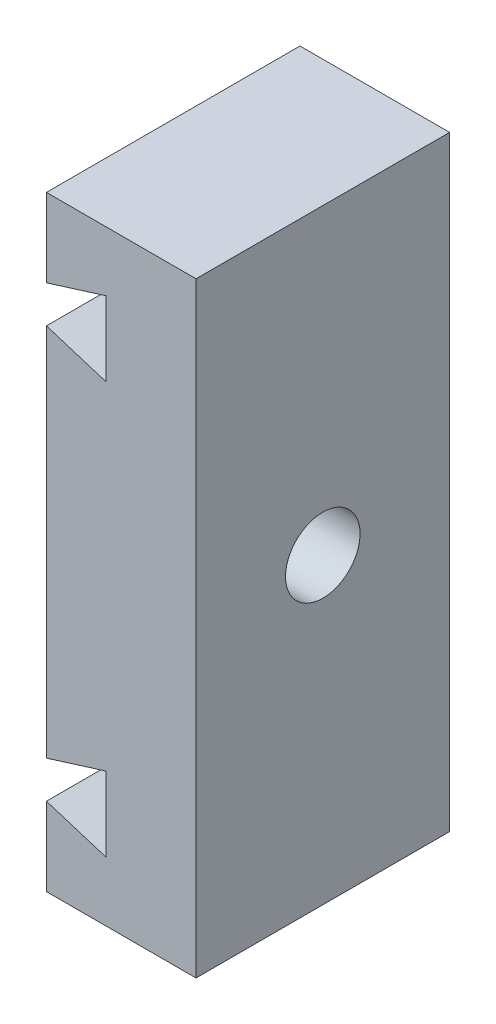
ISO-10303-21;
HEADER;
FILE_DESCRIPTION(('STEP AP214'),'2;1');
FILE_NAME('part.step','',(''),(''),'','','');
FILE_SCHEMA(('AUTOMOTIVE_DESIGN { 1 0 10303 214 1 1 1 1 }'));
ENDSEC;
DATA;
#1=APPLICATION_CONTEXT('core data for automotive mechanical design processes');
#2=APPLICATION_PROTOCOL_DEFINITION('international standard','automotive_design',2000,#1);
#3=PRODUCT_CONTEXT('',#1,'mechanical');
#4=PRODUCT('Part','Part','',(#3));
#5=PRODUCT_RELATED_PRODUCT_CATEGORY('part','',(#4));
#6=PRODUCT_DEFINITION_FORMATION('','',#4);
#7=PRODUCT_DEFINITION_CONTEXT('part definition',#1,'design');
#8=PRODUCT_DEFINITION('design','',#6,#7);
#9=PRODUCT_DEFINITION_SHAPE('','',#8);
#10=(LENGTH_UNIT() NAMED_UNIT(*) SI_UNIT(.MILLI.,.METRE.));
#11=(NAMED_UNIT(*) PLANE_ANGLE_UNIT() SI_UNIT($,.RADIAN.));
#12=(NAMED_UNIT(*) SI_UNIT($,.STERADIAN.) SOLID_ANGLE_UNIT());
#13=UNCERTAINTY_MEASURE_WITH_UNIT(LENGTH_MEASURE(1.E-05),#10,'distance_accuracy_value','');
#14=(GEOMETRIC_REPRESENTATION_CONTEXT(3) GLOBAL_UNCERTAINTY_ASSIGNED_CONTEXT((#13)) GLOBAL_UNIT_ASSIGNED_CONTEXT((#10,
#11,#12)) REPRESENTATION_CONTEXT('',''));
#15=CARTESIAN_POINT('',(0.,0.,0.));
#16=DIRECTION('',(0.,0.,1.));
#17=DIRECTION('',(1.,0.,0.));
#18=AXIS2_PLACEMENT_3D('',#15,#16,#17);
#19=CARTESIAN_POINT('',(18.65,0.,4.25));
#20=DIRECTION('',(-1.,0.,0.));
#21=DIRECTION('',(0.,0.,1.));
#22=AXIS2_PLACEMENT_3D('',#19,#20,#21);
#23=CYLINDRICAL_SURFACE('',#22,1.25);
#24=CARTESIAN_POINT('',(15.1656478378989,0.,4.25));
#25=DIRECTION('',(-1.,0.,0.));
#26=DIRECTION('',(0.,0.,1.));
#27=AXIS2_PLACEMENT_3D('',#24,#25,#26);
#28=CIRCLE('',#27,1.25);
#29=CARTESIAN_POINT('',(15.1656478378989,0.,5.5));
#30=VERTEX_POINT('',#29);
#31=EDGE_CURVE('E161',#30,#30,#28,.T.);
#32=ORIENTED_EDGE('',*,*,#31,.F.);
#33=EDGE_LOOP('',(#32));
#34=FACE_BOUND('',#33,.T.);
#35=CARTESIAN_POINT('',(12.65,0.,4.25));
#36=DIRECTION('',(-1.,0.,0.));
#37=DIRECTION('',(0.,0.,1.));
#38=AXIS2_PLACEMENT_3D('',#35,#36,#37);
#39=CIRCLE('',#38,1.25);
#40=CARTESIAN_POINT('',(12.65,0.,5.5));
#41=VERTEX_POINT('',#40);
#42=EDGE_CURVE('E39',#41,#41,#39,.F.);
#43=ORIENTED_EDGE('',*,*,#42,.F.);
#44=EDGE_LOOP('',(#43));
#45=FACE_BOUND('',#44,.T.);
#46=ADVANCED_FACE('F35',(#34,#45),#23,.F.);
#47=CARTESIAN_POINT('',(15.1656478378989,10.15,8.5));
#48=DIRECTION('',(-1.,0.,0.));
#49=DIRECTION('',(0.,0.,1.));
#50=AXIS2_PLACEMENT_3D('',#47,#48,#49);
#51=PLANE('',#50);
#52=ORIENTED_EDGE('',*,*,#31,.T.);
#53=EDGE_LOOP('',(#52));
#54=FACE_BOUND('',#53,.T.);
#55=DIRECTION('',(0.,1.,0.));
#56=VECTOR('',#55,1.);
#57=CARTESIAN_POINT('',(15.1656478378989,10.15,0.));
#58=LINE('',#57,#56);
#59=CARTESIAN_POINT('',(15.1656478378989,-10.15,0.));
#60=VERTEX_POINT('',#59);
#61=CARTESIAN_POINT('',(15.1656478378989,10.15,0.));
#62=VERTEX_POINT('',#61);
#63=EDGE_CURVE('E157',#60,#62,#58,.T.);
#64=ORIENTED_EDGE('',*,*,#63,.T.);
#65=DIRECTION('',(0.,0.,-1.));
#66=VECTOR('',#65,1.);
#67=CARTESIAN_POINT('',(15.1656478378989,10.15,8.5));
#68=LINE('',#67,#66);
#69=CARTESIAN_POINT('',(15.1656478378989,10.15,8.5));
#70=VERTEX_POINT('',#69);
#71=EDGE_CURVE('E11',#70,#62,#68,.T.);
#72=ORIENTED_EDGE('',*,*,#71,.F.);
#73=DIRECTION('',(0.,1.,0.));
#74=VECTOR('',#73,1.);
#75=CARTESIAN_POINT('',(15.1656478378989,10.15,8.5));
#76=LINE('',#75,#74);
#77=CARTESIAN_POINT('',(15.1656478378989,-10.15,8.5));
#78=VERTEX_POINT('',#77);
#79=EDGE_CURVE('E180',#78,#70,#76,.T.);
#80=ORIENTED_EDGE('',*,*,#79,.F.);
#81=DIRECTION('',(0.,0.,-1.));
#82=VECTOR('',#81,1.);
#83=CARTESIAN_POINT('',(15.1656478378989,-10.15,8.5));
#84=LINE('',#83,#82);
#85=EDGE_CURVE('E153',#78,#60,#84,.T.);
#86=ORIENTED_EDGE('',*,*,#85,.T.);
#87=EDGE_LOOP('',(#64,#72,#80,#86));
#88=FACE_BOUND('',#87,.T.);
#89=ADVANCED_FACE('F37',(#54,#88),#51,.F.);
#90=CARTESIAN_POINT('',(10.15,10.15,8.5));
#91=DIRECTION('',(0.,-1.,0.));
#92=DIRECTION('',(0.,0.,-1.));
#93=AXIS2_PLACEMENT_3D('',#90,#91,#92);
#94=PLANE('',#93);
#95=DIRECTION('',(-1.,0.,0.));
#96=VECTOR('',#95,1.);
#97=CARTESIAN_POINT('',(10.15,10.15,0.));
#98=LINE('',#97,#96);
#99=CARTESIAN_POINT('',(10.15,10.15,0.));
#100=VERTEX_POINT('',#99);
#101=EDGE_CURVE('E160',#62,#100,#98,.T.);
#102=ORIENTED_EDGE('',*,*,#101,.T.);
#103=DIRECTION('',(0.,0.,-1.));
#104=VECTOR('',#103,1.);
#105=CARTESIAN_POINT('',(10.15,10.15,8.5));
#106=LINE('',#105,#104);
#107=CARTESIAN_POINT('',(10.15,10.15,8.5));
#108=VERTEX_POINT('',#107);
#109=EDGE_CURVE('E45',#108,#100,#106,.T.);
#110=ORIENTED_EDGE('',*,*,#109,.F.);
#111=DIRECTION('',(-1.,0.,0.));
#112=VECTOR('',#111,1.);
#113=CARTESIAN_POINT('',(10.15,10.15,8.5));
#114=LINE('',#113,#112);
#115=EDGE_CURVE('E108',#70,#108,#114,.T.);
#116=ORIENTED_EDGE('',*,*,#115,.F.);
#117=ORIENTED_EDGE('',*,*,#71,.T.);
#118=EDGE_LOOP('',(#102,#110,#116,#117));
#119=FACE_BOUND('',#118,.T.);
#120=ADVANCED_FACE('F264',(#119),#94,.F.);
#121=CARTESIAN_POINT('',(10.15,10.15,8.5));
#122=DIRECTION('',(1.,0.,0.));
#123=DIRECTION('',(0.,0.,-1.));
#124=AXIS2_PLACEMENT_3D('',#121,#122,#123);
#125=PLANE('',#124);
#126=DIRECTION('',(0.,-1.,0.));
#127=VECTOR('',#126,1.);
#128=CARTESIAN_POINT('',(10.15,10.15,0.));
#129=LINE('',#128,#127);
#130=CARTESIAN_POINT('',(10.15,7.525,0.));
#131=VERTEX_POINT('',#130);
#132=EDGE_CURVE('E163',#100,#131,#129,.T.);
#133=ORIENTED_EDGE('',*,*,#132,.T.);
#134=DIRECTION('',(0.,0.,-1.));
#135=VECTOR('',#134,1.);
#136=CARTESIAN_POINT('',(10.15,7.525,8.5));
#137=LINE('',#136,#135);
#138=CARTESIAN_POINT('',(10.15,7.525,8.5));
#139=VERTEX_POINT('',#138);
#140=EDGE_CURVE('E199',#139,#131,#137,.T.);
#141=ORIENTED_EDGE('',*,*,#140,.F.);
#142=DIRECTION('',(0.,-1.,0.));
#143=VECTOR('',#142,1.);
#144=CARTESIAN_POINT('',(10.15,10.15,8.5));
#145=LINE('',#144,#143);
#146=EDGE_CURVE('E208',#108,#139,#145,.T.);
#147=ORIENTED_EDGE('',*,*,#146,.F.);
#148=ORIENTED_EDGE('',*,*,#109,.T.);
#149=EDGE_LOOP('',(#133,#141,#147,#148));
#150=FACE_BOUND('',#149,.T.);
#151=ADVANCED_FACE('F206',(#150),#125,.F.);
#152=CARTESIAN_POINT('',(12.15,8.15,8.5));
#153=DIRECTION('',(-0.298274993135945,0.95447997803503,0.));
#154=DIRECTION('',(-0.95447997803503,-0.298274993135945,0.));
#155=AXIS2_PLACEMENT_3D('',#152,#153,#154);
#156=PLANE('',#155);
#157=DIRECTION('',(0.95447997803503,0.298274993135945,0.));
#158=VECTOR('',#157,1.);
#159=CARTESIAN_POINT('',(12.15,8.15,0.));
#160=LINE('',#159,#158);
#161=CARTESIAN_POINT('',(12.15,8.15,0.));
#162=VERTEX_POINT('',#161);
#163=EDGE_CURVE('E165',#131,#162,#160,.T.);
#164=ORIENTED_EDGE('',*,*,#163,.T.);
#165=DIRECTION('',(0.,0.,-1.));
#166=VECTOR('',#165,1.);
#167=CARTESIAN_POINT('',(12.15,8.15,8.5));
#168=LINE('',#167,#166);
#169=CARTESIAN_POINT('',(12.15,8.15,8.5));
#170=VERTEX_POINT('',#169);
#171=EDGE_CURVE('E196',#170,#162,#168,.T.);
#172=ORIENTED_EDGE('',*,*,#171,.F.);
#173=DIRECTION('',(0.95447997803503,0.298274993135945,0.));
#174=VECTOR('',#173,1.);
#175=CARTESIAN_POINT('',(12.15,8.15,8.5));
#176=LINE('',#175,#174);
#177=EDGE_CURVE('E226',#139,#170,#176,.T.);
#178=ORIENTED_EDGE('',*,*,#177,.F.);
#179=ORIENTED_EDGE('',*,*,#140,.T.);
#180=EDGE_LOOP('',(#164,#172,#178,#179));
#181=FACE_BOUND('',#180,.T.);
#182=ADVANCED_FACE('F217',(#181),#156,.F.);
#183=CARTESIAN_POINT('',(12.15,8.15,8.5));
#184=DIRECTION('',(1.,0.,0.));
#185=DIRECTION('',(0.,0.,-1.));
#186=AXIS2_PLACEMENT_3D('',#183,#184,#185);
#187=PLANE('',#186);
#188=DIRECTION('',(0.,-1.,0.));
#189=VECTOR('',#188,1.);
#190=CARTESIAN_POINT('',(12.15,8.15,0.));
#191=LINE('',#190,#189);
#192=CARTESIAN_POINT('',(12.15,5.65,0.));
#193=VERTEX_POINT('',#192);
#194=EDGE_CURVE('E167',#162,#193,#191,.T.);
#195=ORIENTED_EDGE('',*,*,#194,.T.);
#196=DIRECTION('',(0.,0.,-1.));
#197=VECTOR('',#196,1.);
#198=CARTESIAN_POINT('',(12.15,5.65,8.5));
#199=LINE('',#198,#197);
#200=CARTESIAN_POINT('',(12.15,5.65,8.5));
#201=VERTEX_POINT('',#200);
#202=EDGE_CURVE('E193',#201,#193,#199,.T.);
#203=ORIENTED_EDGE('',*,*,#202,.F.);
#204=DIRECTION('',(0.,-1.,0.));
#205=VECTOR('',#204,1.);
#206=CARTESIAN_POINT('',(12.15,8.15,8.5));
#207=LINE('',#206,#205);
#208=EDGE_CURVE('E223',#170,#201,#207,.T.);
#209=ORIENTED_EDGE('',*,*,#208,.F.);
#210=ORIENTED_EDGE('',*,*,#171,.T.);
#211=EDGE_LOOP('',(#195,#203,#209,#210));
#212=FACE_BOUND('',#211,.T.);
#213=ADVANCED_FACE('F221',(#212),#187,.F.);
#214=CARTESIAN_POINT('',(12.15,5.65,8.5));
#215=DIRECTION('',(-0.298274993135947,-0.95447997803503,0.));
#216=DIRECTION('',(0.95447997803503,-0.298274993135947,0.));
#217=AXIS2_PLACEMENT_3D('',#214,#215,#216);
#218=PLANE('',#217);
#219=DIRECTION('',(-0.95447997803503,0.298274993135947,0.));
#220=VECTOR('',#219,1.);
#221=CARTESIAN_POINT('',(12.15,5.65,0.));
#222=LINE('',#221,#220);
#223=CARTESIAN_POINT('',(10.15,6.275,0.));
#224=VERTEX_POINT('',#223);
#225=EDGE_CURVE('E169',#193,#224,#222,.T.);
#226=ORIENTED_EDGE('',*,*,#225,.T.);
#227=DIRECTION('',(0.,0.,-1.));
#228=VECTOR('',#227,1.);
#229=CARTESIAN_POINT('',(10.15,6.275,8.5));
#230=LINE('',#229,#228);
#231=CARTESIAN_POINT('',(10.15,6.275,8.5));
#232=VERTEX_POINT('',#231);
#233=EDGE_CURVE('E190',#232,#224,#230,.T.);
#234=ORIENTED_EDGE('',*,*,#233,.F.);
#235=DIRECTION('',(-0.95447997803503,0.298274993135947,0.));
#236=VECTOR('',#235,1.);
#237=CARTESIAN_POINT('',(12.15,5.65,8.5));
#238=LINE('',#237,#236);
#239=EDGE_CURVE('E225',#201,#232,#238,.T.);
#240=ORIENTED_EDGE('',*,*,#239,.F.);
#241=ORIENTED_EDGE('',*,*,#202,.T.);
#242=EDGE_LOOP('',(#226,#234,#240,#241));
#243=FACE_BOUND('',#242,.T.);
#244=ADVANCED_FACE('F301',(#243),#218,.F.);
#245=CARTESIAN_POINT('',(10.15,6.275,8.5));
#246=DIRECTION('',(1.,0.,0.));
#247=DIRECTION('',(0.,0.,-1.));
#248=AXIS2_PLACEMENT_3D('',#245,#246,#247);
#249=PLANE('',#248);
#250=CARTESIAN_POINT('',(10.15,0.,4.25));
#251=DIRECTION('',(-1.,0.,0.));
#252=DIRECTION('',(0.,0.,1.));
#253=AXIS2_PLACEMENT_3D('',#250,#251,#252);
#254=CIRCLE('',#253,3.);
#255=CARTESIAN_POINT('',(10.15,0.,7.25));
#256=VERTEX_POINT('',#255);
#257=EDGE_CURVE('E289',#256,#256,#254,.T.);
#258=ORIENTED_EDGE('',*,*,#257,.F.);
#259=EDGE_LOOP('',(#258));
#260=FACE_BOUND('',#259,.T.);
#261=DIRECTION('',(0.,-1.,0.));
#262=VECTOR('',#261,1.);
#263=CARTESIAN_POINT('',(10.15,6.275,0.));
#264=LINE('',#263,#262);
#265=CARTESIAN_POINT('',(10.15,-6.275,0.));
#266=VERTEX_POINT('',#265);
#267=EDGE_CURVE('E171',#224,#266,#264,.T.);
#268=ORIENTED_EDGE('',*,*,#267,.T.);
#269=DIRECTION('',(0.,0.,-1.));
#270=VECTOR('',#269,1.);
#271=CARTESIAN_POINT('',(10.15,-6.275,8.5));
#272=LINE('',#271,#270);
#273=CARTESIAN_POINT('',(10.15,-6.275,8.5));
#274=VERTEX_POINT('',#273);
#275=EDGE_CURVE('E187',#274,#266,#272,.T.);
#276=ORIENTED_EDGE('',*,*,#275,.F.);
#277=DIRECTION('',(0.,-1.,0.));
#278=VECTOR('',#277,1.);
#279=CARTESIAN_POINT('',(10.15,6.275,8.5));
#280=LINE('',#279,#278);
#281=EDGE_CURVE('E228',#232,#274,#280,.T.);
#282=ORIENTED_EDGE('',*,*,#281,.F.);
#283=ORIENTED_EDGE('',*,*,#233,.T.);
#284=EDGE_LOOP('',(#268,#276,#282,#283));
#285=FACE_BOUND('',#284,.T.);
#286=ADVANCED_FACE('F298',(#260,#285),#249,.F.);
#287=CARTESIAN_POINT('',(12.15,-5.65,8.5));
#288=DIRECTION('',(-0.298274993135949,0.954479978035029,0.));
#289=DIRECTION('',(-0.954479978035029,-0.298274993135949,0.));
#290=AXIS2_PLACEMENT_3D('',#287,#288,#289);
#291=PLANE('',#290);
#292=DIRECTION('',(0.954479978035029,0.298274993135949,0.));
#293=VECTOR('',#292,1.);
#294=CARTESIAN_POINT('',(12.15,-5.65,0.));
#295=LINE('',#294,#293);
#296=CARTESIAN_POINT('',(12.15,-5.65,0.));
#297=VERTEX_POINT('',#296);
#298=EDGE_CURVE('E173',#266,#297,#295,.T.);
#299=ORIENTED_EDGE('',*,*,#298,.T.);
#300=DIRECTION('',(0.,0.,-1.));
#301=VECTOR('',#300,1.);
#302=CARTESIAN_POINT('',(12.15,-5.65,8.5));
#303=LINE('',#302,#301);
#304=CARTESIAN_POINT('',(12.15,-5.65,8.5));
#305=VERTEX_POINT('',#304);
#306=EDGE_CURVE('E184',#305,#297,#303,.T.);
#307=ORIENTED_EDGE('',*,*,#306,.F.);
#308=DIRECTION('',(0.954479978035029,0.298274993135949,0.));
#309=VECTOR('',#308,1.);
#310=CARTESIAN_POINT('',(12.15,-5.65,8.5));
#311=LINE('',#310,#309);
#312=EDGE_CURVE('E234',#274,#305,#311,.T.);
#313=ORIENTED_EDGE('',*,*,#312,.F.);
#314=ORIENTED_EDGE('',*,*,#275,.T.);
#315=EDGE_LOOP('',(#299,#307,#313,#314));
#316=FACE_BOUND('',#315,.T.);
#317=ADVANCED_FACE('F240',(#316),#291,.F.);
#318=CARTESIAN_POINT('',(12.15,-5.65,8.5));
#319=DIRECTION('',(1.,0.,0.));
#320=DIRECTION('',(0.,0.,-1.));
#321=AXIS2_PLACEMENT_3D('',#318,#319,#320);
#322=PLANE('',#321);
#323=DIRECTION('',(0.,-1.,0.));
#324=VECTOR('',#323,1.);
#325=CARTESIAN_POINT('',(12.15,-5.65,0.));
#326=LINE('',#325,#324);
#327=CARTESIAN_POINT('',(12.15,-8.15,0.));
#328=VERTEX_POINT('',#327);
#329=EDGE_CURVE('E175',#297,#328,#326,.T.);
#330=ORIENTED_EDGE('',*,*,#329,.T.);
#331=DIRECTION('',(0.,0.,-1.));
#332=VECTOR('',#331,1.);
#333=CARTESIAN_POINT('',(12.15,-8.15,8.5));
#334=LINE('',#333,#332);
#335=CARTESIAN_POINT('',(12.15,-8.15,8.5));
#336=VERTEX_POINT('',#335);
#337=EDGE_CURVE('E148',#336,#328,#334,.T.);
#338=ORIENTED_EDGE('',*,*,#337,.F.);
#339=DIRECTION('',(0.,-1.,0.));
#340=VECTOR('',#339,1.);
#341=CARTESIAN_POINT('',(12.15,-5.65,8.5));
#342=LINE('',#341,#340);
#343=EDGE_CURVE('E139',#305,#336,#342,.T.);
#344=ORIENTED_EDGE('',*,*,#343,.F.);
#345=ORIENTED_EDGE('',*,*,#306,.T.);
#346=EDGE_LOOP('',(#330,#338,#344,#345));
#347=FACE_BOUND('',#346,.T.);
#348=ADVANCED_FACE('F244',(#347),#322,.F.);
#349=CARTESIAN_POINT('',(12.15,-8.15,8.5));
#350=DIRECTION('',(-0.298274993135951,-0.954479978035029,0.));
#351=DIRECTION('',(0.954479978035028,-0.298274993135951,0.));
#352=AXIS2_PLACEMENT_3D('',#349,#350,#351);
#353=PLANE('',#352);
#354=DIRECTION('',(-0.954479978035028,0.298274993135951,0.));
#355=VECTOR('',#354,1.);
#356=CARTESIAN_POINT('',(12.15,-8.15,0.));
#357=LINE('',#356,#355);
#358=CARTESIAN_POINT('',(10.15,-7.525,0.));
#359=VERTEX_POINT('',#358);
#360=EDGE_CURVE('E147',#328,#359,#357,.T.);
#361=ORIENTED_EDGE('',*,*,#360,.T.);
#362=DIRECTION('',(0.,0.,-1.));
#363=VECTOR('',#362,1.);
#364=CARTESIAN_POINT('',(10.15,-7.525,8.5));
#365=LINE('',#364,#363);
#366=CARTESIAN_POINT('',(10.15,-7.525,8.5));
#367=VERTEX_POINT('',#366);
#368=EDGE_CURVE('E144',#367,#359,#365,.T.);
#369=ORIENTED_EDGE('',*,*,#368,.F.);
#370=DIRECTION('',(-0.954479978035028,0.298274993135951,0.));
#371=VECTOR('',#370,1.);
#372=CARTESIAN_POINT('',(12.15,-8.15,8.5));
#373=LINE('',#372,#371);
#374=EDGE_CURVE('E133',#336,#367,#373,.T.);
#375=ORIENTED_EDGE('',*,*,#374,.F.);
#376=ORIENTED_EDGE('',*,*,#337,.T.);
#377=EDGE_LOOP('',(#361,#369,#375,#376));
#378=FACE_BOUND('',#377,.T.);
#379=ADVANCED_FACE('F145',(#378),#353,.F.);
#380=CARTESIAN_POINT('',(10.15,-7.525,8.5));
#381=DIRECTION('',(1.,0.,0.));
#382=DIRECTION('',(0.,1.,0.));
#383=AXIS2_PLACEMENT_3D('',#380,#381,#382);
#384=PLANE('',#383);
#385=DIRECTION('',(0.,-1.,0.));
#386=VECTOR('',#385,1.);
#387=CARTESIAN_POINT('',(10.15,-7.525,0.));
#388=LINE('',#387,#386);
#389=CARTESIAN_POINT('',(10.15,-10.15,0.));
#390=VERTEX_POINT('',#389);
#391=EDGE_CURVE('E94',#359,#390,#388,.T.);
#392=ORIENTED_EDGE('',*,*,#391,.T.);
#393=DIRECTION('',(0.,0.,-1.));
#394=VECTOR('',#393,1.);
#395=CARTESIAN_POINT('',(10.15,-10.15,8.5));
#396=LINE('',#395,#394);
#397=CARTESIAN_POINT('',(10.15,-10.15,8.5));
#398=VERTEX_POINT('',#397);
#399=EDGE_CURVE('E149',#398,#390,#396,.T.);
#400=ORIENTED_EDGE('',*,*,#399,.F.);
#401=DIRECTION('',(0.,-1.,0.));
#402=VECTOR('',#401,1.);
#403=CARTESIAN_POINT('',(10.15,-7.525,8.5));
#404=LINE('',#403,#402);
#405=EDGE_CURVE('E137',#367,#398,#404,.T.);
#406=ORIENTED_EDGE('',*,*,#405,.F.);
#407=ORIENTED_EDGE('',*,*,#368,.T.);
#408=EDGE_LOOP('',(#392,#400,#406,#407));
#409=FACE_BOUND('',#408,.T.);
#410=ADVANCED_FACE('F151',(#409),#384,.F.);
#411=CARTESIAN_POINT('',(15.1656478378989,-10.15,8.5));
#412=DIRECTION('',(0.,1.,0.));
#413=DIRECTION('',(0.,0.,1.));
#414=AXIS2_PLACEMENT_3D('',#411,#412,#413);
#415=PLANE('',#414);
#416=DIRECTION('',(1.,0.,0.));
#417=VECTOR('',#416,1.);
#418=CARTESIAN_POINT('',(15.1656478378989,-10.15,0.));
#419=LINE('',#418,#417);
#420=EDGE_CURVE('E100',#390,#60,#419,.T.);
#421=ORIENTED_EDGE('',*,*,#420,.T.);
#422=ORIENTED_EDGE('',*,*,#85,.F.);
#423=DIRECTION('',(1.,0.,0.));
#424=VECTOR('',#423,1.);
#425=CARTESIAN_POINT('',(15.1656478378989,-10.15,8.5));
#426=LINE('',#425,#424);
#427=EDGE_CURVE('E53',#398,#78,#426,.T.);
#428=ORIENTED_EDGE('',*,*,#427,.F.);
#429=ORIENTED_EDGE('',*,*,#399,.T.);
#430=EDGE_LOOP('',(#421,#422,#428,#429));
#431=FACE_BOUND('',#430,.T.);
#432=ADVANCED_FACE('F248',(#431),#415,.F.);
#433=CARTESIAN_POINT('',(0.,0.,8.5));
#434=DIRECTION('',(0.,0.,-1.));
#435=DIRECTION('',(-1.,0.,0.));
#436=AXIS2_PLACEMENT_3D('',#433,#434,#435);
#437=PLANE('',#436);
#438=ORIENTED_EDGE('',*,*,#79,.T.);
#439=ORIENTED_EDGE('',*,*,#115,.T.);
#440=ORIENTED_EDGE('',*,*,#146,.T.);
#441=ORIENTED_EDGE('',*,*,#177,.T.);
#442=ORIENTED_EDGE('',*,*,#208,.T.);
#443=ORIENTED_EDGE('',*,*,#239,.T.);
#444=ORIENTED_EDGE('',*,*,#281,.T.);
#445=ORIENTED_EDGE('',*,*,#312,.T.);
#446=ORIENTED_EDGE('',*,*,#343,.T.);
#447=ORIENTED_EDGE('',*,*,#374,.T.);
#448=ORIENTED_EDGE('',*,*,#405,.T.);
#449=ORIENTED_EDGE('',*,*,#427,.T.);
#450=EDGE_LOOP('',(#438,#439,#440,#441,#442,#443,#444,#445,#446,#447,#448,#449));
#451=FACE_BOUND('',#450,.T.);
#452=ADVANCED_FACE('F135',(#451),#437,.F.);
#453=CARTESIAN_POINT('',(0.,0.,0.));
#454=DIRECTION('',(0.,0.,-1.));
#455=DIRECTION('',(-1.,0.,0.));
#456=AXIS2_PLACEMENT_3D('',#453,#454,#455);
#457=PLANE('',#456);
#458=ORIENTED_EDGE('',*,*,#63,.F.);
#459=ORIENTED_EDGE('',*,*,#420,.F.);
#460=ORIENTED_EDGE('',*,*,#391,.F.);
#461=ORIENTED_EDGE('',*,*,#360,.F.);
#462=ORIENTED_EDGE('',*,*,#329,.F.);
#463=ORIENTED_EDGE('',*,*,#298,.F.);
#464=ORIENTED_EDGE('',*,*,#267,.F.);
#465=ORIENTED_EDGE('',*,*,#225,.F.);
#466=ORIENTED_EDGE('',*,*,#194,.F.);
#467=ORIENTED_EDGE('',*,*,#163,.F.);
#468=ORIENTED_EDGE('',*,*,#132,.F.);
#469=ORIENTED_EDGE('',*,*,#101,.F.);
#470=EDGE_LOOP('',(#458,#459,#460,#461,#462,#463,#464,#465,#466,#467,#468,#469));
#471=FACE_BOUND('',#470,.T.);
#472=ADVANCED_FACE('F212',(#471),#457,.T.);
#473=CARTESIAN_POINT('',(12.65,0.,4.25));
#474=DIRECTION('',(-1.,0.,0.));
#475=DIRECTION('',(0.,0.,1.));
#476=AXIS2_PLACEMENT_3D('',#473,#474,#475);
#477=PLANE('',#476);
#478=CARTESIAN_POINT('',(12.65,0.,4.25));
#479=DIRECTION('',(-1.,0.,0.));
#480=DIRECTION('',(0.,0.,1.));
#481=AXIS2_PLACEMENT_3D('',#478,#479,#480);
#482=CIRCLE('',#481,3.);
#483=CARTESIAN_POINT('',(12.65,0.,7.25));
#484=VERTEX_POINT('',#483);
#485=EDGE_CURVE('E284',#484,#484,#482,.T.);
#486=ORIENTED_EDGE('',*,*,#485,.T.);
#487=EDGE_LOOP('',(#486));
#488=FACE_BOUND('',#487,.T.);
#489=ORIENTED_EDGE('',*,*,#42,.T.);
#490=EDGE_LOOP('',(#489));
#491=FACE_BOUND('',#490,.T.);
#492=ADVANCED_FACE('F272',(#488,#491),#477,.T.);
#493=CARTESIAN_POINT('',(12.65,0.,4.25));
#494=DIRECTION('',(-1.,0.,0.));
#495=DIRECTION('',(0.,0.,1.));
#496=AXIS2_PLACEMENT_3D('',#493,#494,#495);
#497=CYLINDRICAL_SURFACE('',#496,3.);
#498=ORIENTED_EDGE('',*,*,#485,.F.);
#499=EDGE_LOOP('',(#498));
#500=FACE_BOUND('',#499,.T.);
#501=ORIENTED_EDGE('',*,*,#257,.T.);
#502=EDGE_LOOP('',(#501));
#503=FACE_BOUND('',#502,.T.);
#504=ADVANCED_FACE('F269',(#500,#503),#497,.F.);
#505=CLOSED_SHELL('',(#46,#89,#120,#151,#182,#213,#244,#286,#317,#348,#379,#410,#432,#452,#472,
#492,#504));
#506=MANIFOLD_SOLID_BREP('B2',#505);
#507=ADVANCED_BREP_SHAPE_REPRESENTATION('',(#18,#506),#14);
#508=SHAPE_DEFINITION_REPRESENTATION(#9,#507);
ENDSEC;
END-ISO-10303-21;
